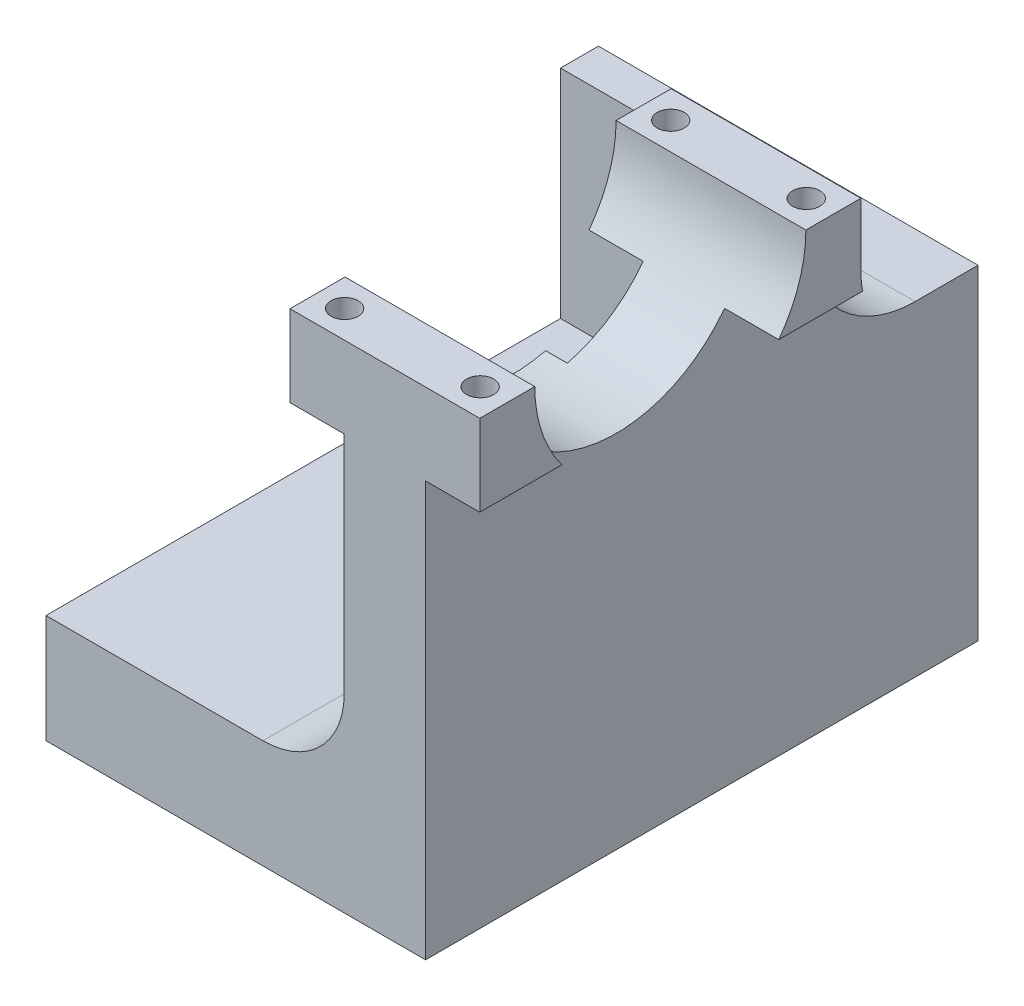
ISO-10303-21;
HEADER;
FILE_DESCRIPTION(('STEP AP214'),'2;1');
FILE_NAME('part.step','',(''),(''),'','','');
FILE_SCHEMA(('AUTOMOTIVE_DESIGN { 1 0 10303 214 1 1 1 1 }'));
ENDSEC;
DATA;
#1=APPLICATION_CONTEXT('core data for automotive mechanical design processes');
#2=APPLICATION_PROTOCOL_DEFINITION('international standard','automotive_design',2000,#1);
#3=PRODUCT_CONTEXT('',#1,'mechanical');
#4=PRODUCT('Part','Part','',(#3));
#5=PRODUCT_RELATED_PRODUCT_CATEGORY('part','',(#4));
#6=PRODUCT_DEFINITION_FORMATION('','',#4);
#7=PRODUCT_DEFINITION_CONTEXT('part definition',#1,'design');
#8=PRODUCT_DEFINITION('design','',#6,#7);
#9=PRODUCT_DEFINITION_SHAPE('','',#8);
#10=(LENGTH_UNIT() NAMED_UNIT(*) SI_UNIT(.MILLI.,.METRE.));
#11=(NAMED_UNIT(*) PLANE_ANGLE_UNIT() SI_UNIT($,.RADIAN.));
#12=(NAMED_UNIT(*) SI_UNIT($,.STERADIAN.) SOLID_ANGLE_UNIT());
#13=UNCERTAINTY_MEASURE_WITH_UNIT(LENGTH_MEASURE(1.E-05),#10,'distance_accuracy_value','');
#14=(GEOMETRIC_REPRESENTATION_CONTEXT(3) GLOBAL_UNCERTAINTY_ASSIGNED_CONTEXT((#13)) GLOBAL_UNIT_ASSIGNED_CONTEXT((#10,
#11,#12)) REPRESENTATION_CONTEXT('',''));
#15=CARTESIAN_POINT('',(0.,0.,0.));
#16=DIRECTION('',(0.,0.,1.));
#17=DIRECTION('',(1.,0.,0.));
#18=AXIS2_PLACEMENT_3D('',#15,#16,#17);
#19=CARTESIAN_POINT('',(-65.425,59.,35.0524601018634));
#20=DIRECTION('',(1.,0.,0.));
#21=DIRECTION('',(0.,0.,-1.));
#22=AXIS2_PLACEMENT_3D('',#19,#20,#21);
#23=CYLINDRICAL_SURFACE('',#22,10.);
#24=CARTESIAN_POINT('',(-52.925,59.,35.0524601018634));
#25=DIRECTION('',(-1.,0.,0.));
#26=DIRECTION('',(0.,0.,1.));
#27=AXIS2_PLACEMENT_3D('',#24,#25,#26);
#28=CIRCLE('',#27,10.);
#29=CARTESIAN_POINT('',(-52.925,57.25,44.898144435621));
#30=VERTEX_POINT('',#29);
#31=CARTESIAN_POINT('',(-52.925,59.,45.0524601018634));
#32=VERTEX_POINT('',#31);
#33=EDGE_CURVE('E422',#30,#32,#28,.T.);
#34=ORIENTED_EDGE('',*,*,#33,.F.);
#35=DIRECTION('',(1.,0.,0.));
#36=VECTOR('',#35,1.);
#37=CARTESIAN_POINT('',(-65.425,57.25,44.898144435621));
#38=LINE('',#37,#36);
#39=CARTESIAN_POINT('',(-57.925,57.25,44.898144435621));
#40=VERTEX_POINT('',#39);
#41=EDGE_CURVE('E419',#40,#30,#38,.T.);
#42=ORIENTED_EDGE('',*,*,#41,.F.);
#43=CARTESIAN_POINT('',(-57.925,59.,35.0524601018634));
#44=DIRECTION('',(-1.,0.,0.));
#45=DIRECTION('',(0.,0.,1.));
#46=AXIS2_PLACEMENT_3D('',#43,#44,#45);
#47=CIRCLE('',#46,10.);
#48=CARTESIAN_POINT('',(-57.925,49.,35.0524601018634));
#49=VERTEX_POINT('',#48);
#50=EDGE_CURVE('E43',#40,#49,#47,.F.);
#51=ORIENTED_EDGE('',*,*,#50,.T.);
#52=DIRECTION('',(-1.,0.,0.));
#53=VECTOR('',#52,1.);
#54=CARTESIAN_POINT('',(-65.425,49.,35.0524601018634));
#55=LINE('',#54,#53);
#56=CARTESIAN_POINT('',(-65.425,49.,35.0524601018634));
#57=VERTEX_POINT('',#56);
#58=EDGE_CURVE('E211',#57,#49,#55,.F.);
#59=ORIENTED_EDGE('',*,*,#58,.F.);
#60=CARTESIAN_POINT('',(-65.425,59.,35.0524601018634));
#61=DIRECTION('',(-1.,0.,0.));
#62=DIRECTION('',(0.,0.,1.));
#63=AXIS2_PLACEMENT_3D('',#60,#61,#62);
#64=CIRCLE('',#63,10.);
#65=CARTESIAN_POINT('',(-65.425,57.25,44.898144435621));
#66=VERTEX_POINT('',#65);
#67=EDGE_CURVE('E11',#57,#66,#64,.T.);
#68=ORIENTED_EDGE('',*,*,#67,.T.);
#69=DIRECTION('',(1.,0.,0.));
#70=VECTOR('',#69,1.);
#71=CARTESIAN_POINT('',(-65.425,57.25,44.898144435621));
#72=LINE('',#71,#70);
#73=CARTESIAN_POINT('',(-70.425,57.25,44.898144435621));
#74=VERTEX_POINT('',#73);
#75=EDGE_CURVE('E427',#74,#66,#72,.T.);
#76=ORIENTED_EDGE('',*,*,#75,.F.);
#77=CARTESIAN_POINT('',(-70.425,59.,35.0524601018634));
#78=DIRECTION('',(1.,0.,0.));
#79=DIRECTION('',(0.,0.,-1.));
#80=AXIS2_PLACEMENT_3D('',#77,#78,#79);
#81=CIRCLE('',#80,10.);
#82=CARTESIAN_POINT('',(-70.425,59.,45.0524601018634));
#83=VERTEX_POINT('',#82);
#84=EDGE_CURVE('E424',#83,#74,#81,.T.);
#85=ORIENTED_EDGE('',*,*,#84,.F.);
#86=DIRECTION('',(-1.,0.,0.));
#87=VECTOR('',#86,1.);
#88=CARTESIAN_POINT('',(-65.425,59.,45.0524601018634));
#89=LINE('',#88,#87);
#90=EDGE_CURVE('E415',#32,#83,#89,.T.);
#91=ORIENTED_EDGE('',*,*,#90,.F.);
#92=EDGE_LOOP('',(#34,#42,#51,#59,#68,#76,#85,#91));
#93=FACE_BOUND('',#92,.T.);
#94=ADVANCED_FACE('F36',(#93),#23,.F.);
#95=CARTESIAN_POINT('',(-65.425,-35.9364248901641,45.0524601018634));
#96=DIRECTION('',(0.,0.,1.));
#97=DIRECTION('',(1.,0.,0.));
#98=AXIS2_PLACEMENT_3D('',#95,#96,#97);
#99=PLANE('',#98);
#100=DIRECTION('',(0.,-1.,0.));
#101=VECTOR('',#100,1.);
#102=CARTESIAN_POINT('',(-52.925,64.75,45.0524601018634));
#103=LINE('',#102,#101);
#104=CARTESIAN_POINT('',(-52.925,64.75,45.0524601018634));
#105=VERTEX_POINT('',#104);
#106=EDGE_CURVE('E364',#105,#32,#103,.T.);
#107=ORIENTED_EDGE('',*,*,#106,.T.);
#108=ORIENTED_EDGE('',*,*,#90,.T.);
#109=DIRECTION('',(0.,-1.,0.));
#110=VECTOR('',#109,1.);
#111=CARTESIAN_POINT('',(-70.425,64.75,45.0524601018634));
#112=LINE('',#111,#110);
#113=CARTESIAN_POINT('',(-70.425,64.75,45.0524601018634));
#114=VERTEX_POINT('',#113);
#115=EDGE_CURVE('E346',#114,#83,#112,.T.);
#116=ORIENTED_EDGE('',*,*,#115,.F.);
#117=DIRECTION('',(1.,0.,0.));
#118=VECTOR('',#117,1.);
#119=CARTESIAN_POINT('',(-65.425,64.75,45.0524601018634));
#120=LINE('',#119,#118);
#121=EDGE_CURVE('E388',#114,#105,#120,.T.);
#122=ORIENTED_EDGE('',*,*,#121,.T.);
#123=EDGE_LOOP('',(#107,#108,#116,#122));
#124=FACE_BOUND('',#123,.T.);
#125=ADVANCED_FACE('F503',(#124),#99,.F.);
#126=CARTESIAN_POINT('',(-65.425,-35.9364248901641,45.0524601018634));
#127=DIRECTION('',(-1.,0.,0.));
#128=DIRECTION('',(0.,0.,1.));
#129=AXIS2_PLACEMENT_3D('',#126,#127,#128);
#130=PLANE('',#129);
#131=DIRECTION('',(0.,1.,0.));
#132=VECTOR('',#131,1.);
#133=CARTESIAN_POINT('',(-65.425,49.25,59.625));
#134=LINE('',#133,#132);
#135=CARTESIAN_POINT('',(-65.425,49.25,59.625));
#136=VERTEX_POINT('',#135);
#137=CARTESIAN_POINT('',(-65.425,52.6153389004884,59.625));
#138=VERTEX_POINT('',#137);
#139=EDGE_CURVE('E252',#136,#138,#134,.T.);
#140=ORIENTED_EDGE('',*,*,#139,.T.);
#141=CARTESIAN_POINT('',(-65.425,64.75,62.625));
#142=DIRECTION('',(-1.,0.,0.));
#143=DIRECTION('',(0.,0.,1.));
#144=AXIS2_PLACEMENT_3D('',#141,#142,#143);
#145=CIRCLE('',#144,12.5);
#146=CARTESIAN_POINT('',(-65.425,57.25,52.625));
#147=VERTEX_POINT('',#146);
#148=EDGE_CURVE('E384',#138,#147,#145,.F.);
#149=ORIENTED_EDGE('',*,*,#148,.T.);
#150=DIRECTION('',(0.,0.,1.));
#151=VECTOR('',#150,1.);
#152=CARTESIAN_POINT('',(-65.425,57.25,45.0524601018634));
#153=LINE('',#152,#151);
#154=EDGE_CURVE('E50',#66,#147,#153,.T.);
#155=ORIENTED_EDGE('',*,*,#154,.F.);
#156=ORIENTED_EDGE('',*,*,#67,.F.);
#157=DIRECTION('',(0.,0.,1.));
#158=VECTOR('',#157,1.);
#159=CARTESIAN_POINT('',(-65.425,49.,32.7524601018634));
#160=LINE('',#159,#158);
#161=CARTESIAN_POINT('',(-65.425,49.,32.7524601018634));
#162=VERTEX_POINT('',#161);
#163=EDGE_CURVE('E214',#162,#57,#160,.T.);
#164=ORIENTED_EDGE('',*,*,#163,.F.);
#165=DIRECTION('',(0.,1.,0.));
#166=VECTOR('',#165,1.);
#167=CARTESIAN_POINT('',(-65.425,49.,32.7524601018634));
#168=LINE('',#167,#166);
#169=CARTESIAN_POINT('',(-65.425,36.5,32.7524601018634));
#170=VERTEX_POINT('',#169);
#171=EDGE_CURVE('E215',#170,#162,#168,.T.);
#172=ORIENTED_EDGE('',*,*,#171,.F.);
#173=DIRECTION('',(0.,0.,-1.));
#174=VECTOR('',#173,1.);
#175=CARTESIAN_POINT('',(-65.425,36.5,45.0524601018634));
#176=LINE('',#175,#174);
#177=CARTESIAN_POINT('',(-65.425,36.5,80.1975398981366));
#178=VERTEX_POINT('',#177);
#179=EDGE_CURVE('E410',#170,#178,#176,.F.);
#180=ORIENTED_EDGE('',*,*,#179,.T.);
#181=DIRECTION('',(0.,1.,0.));
#182=VECTOR('',#181,1.);
#183=CARTESIAN_POINT('',(-65.425,-35.9364248901641,80.1975398981366));
#184=LINE('',#183,#182);
#185=CARTESIAN_POINT('',(-65.425,57.25,80.1975398981366));
#186=VERTEX_POINT('',#185);
#187=EDGE_CURVE('E392',#178,#186,#184,.T.);
#188=ORIENTED_EDGE('',*,*,#187,.T.);
#189=DIRECTION('',(0.,0.,-1.));
#190=VECTOR('',#189,1.);
#191=CARTESIAN_POINT('',(-65.425,57.25,80.1975398981366));
#192=LINE('',#191,#190);
#193=CARTESIAN_POINT('',(-65.425,57.25,72.625));
#194=VERTEX_POINT('',#193);
#195=EDGE_CURVE('E325',#186,#194,#192,.T.);
#196=ORIENTED_EDGE('',*,*,#195,.T.);
#197=CARTESIAN_POINT('',(-65.425,52.6153389004884,65.625));
#198=VERTEX_POINT('',#197);
#199=EDGE_CURVE('E385',#194,#198,#145,.F.);
#200=ORIENTED_EDGE('',*,*,#199,.T.);
#201=DIRECTION('',(0.,1.,0.));
#202=VECTOR('',#201,1.);
#203=CARTESIAN_POINT('',(-65.425,49.25,65.625));
#204=LINE('',#203,#202);
#205=CARTESIAN_POINT('',(-65.425,49.25,65.625));
#206=VERTEX_POINT('',#205);
#207=EDGE_CURVE('E267',#206,#198,#204,.T.);
#208=ORIENTED_EDGE('',*,*,#207,.F.);
#209=DIRECTION('',(0.,0.,1.));
#210=VECTOR('',#209,1.);
#211=CARTESIAN_POINT('',(-65.425,49.25,62.625));
#212=LINE('',#211,#210);
#213=EDGE_CURVE('E263',#136,#206,#212,.T.);
#214=ORIENTED_EDGE('',*,*,#213,.F.);
#215=EDGE_LOOP('',(#140,#149,#155,#156,#164,#172,#180,#188,#196,#200,#208,#214));
#216=FACE_BOUND('',#215,.T.);
#217=ADVANCED_FACE('F452',(#216),#130,.T.);
#218=CARTESIAN_POINT('',(-72.925,36.5,0.));
#219=DIRECTION('',(0.,0.,-1.));
#220=DIRECTION('',(-1.,0.,0.));
#221=AXIS2_PLACEMENT_3D('',#218,#219,#220);
#222=CYLINDRICAL_SURFACE('',#221,7.5);
#223=DIRECTION('',(0.,0.,-1.));
#224=VECTOR('',#223,1.);
#225=CARTESIAN_POINT('',(-72.925,29.,0.));
#226=LINE('',#225,#224);
#227=CARTESIAN_POINT('',(-72.925,29.,80.1975398981366));
#228=VERTEX_POINT('',#227);
#229=CARTESIAN_POINT('',(-72.925,29.,32.7524601018634));
#230=VERTEX_POINT('',#229);
#231=EDGE_CURVE('E400',#228,#230,#226,.T.);
#232=ORIENTED_EDGE('',*,*,#231,.F.);
#233=CARTESIAN_POINT('',(-72.925,36.5,80.1975398981366));
#234=DIRECTION('',(0.,0.,1.));
#235=DIRECTION('',(1.,0.,0.));
#236=AXIS2_PLACEMENT_3D('',#233,#234,#235);
#237=CIRCLE('',#236,7.5);
#238=EDGE_CURVE('E413',#228,#178,#237,.T.);
#239=ORIENTED_EDGE('',*,*,#238,.T.);
#240=ORIENTED_EDGE('',*,*,#179,.F.);
#241=CARTESIAN_POINT('',(-72.925,36.5,32.7524601018634));
#242=DIRECTION('',(0.,0.,1.));
#243=DIRECTION('',(1.,0.,0.));
#244=AXIS2_PLACEMENT_3D('',#241,#242,#243);
#245=CIRCLE('',#244,7.5);
#246=EDGE_CURVE('E246',#230,#170,#245,.T.);
#247=ORIENTED_EDGE('',*,*,#246,.F.);
#248=EDGE_LOOP('',(#232,#239,#240,#247));
#249=FACE_BOUND('',#248,.T.);
#250=ADVANCED_FACE('F510',(#249),#222,.F.);
#251=CARTESIAN_POINT('',(-55.425,0.,47.5887300509317));
#252=DIRECTION('',(0.,1.,0.));
#253=DIRECTION('',(0.,0.,1.));
#254=AXIS2_PLACEMENT_3D('',#251,#252,#253);
#255=CYLINDRICAL_SURFACE('',#254,1.25);
#256=CARTESIAN_POINT('',(-55.425,57.25,47.5887300509317));
#257=DIRECTION('',(0.,-1.,0.));
#258=DIRECTION('',(0.,0.,-1.));
#259=AXIS2_PLACEMENT_3D('',#256,#257,#258);
#260=CIRCLE('',#259,1.25);
#261=CARTESIAN_POINT('',(-55.425,57.25,46.3387300509317));
#262=VERTEX_POINT('',#261);
#263=EDGE_CURVE('E363',#262,#262,#260,.F.);
#264=ORIENTED_EDGE('',*,*,#263,.F.);
#265=EDGE_LOOP('',(#264));
#266=FACE_BOUND('',#265,.T.);
#267=CARTESIAN_POINT('',(-55.425,64.75,47.5887300509317));
#268=DIRECTION('',(0.,-1.,0.));
#269=DIRECTION('',(0.,0.,-1.));
#270=AXIS2_PLACEMENT_3D('',#267,#268,#269);
#271=CIRCLE('',#270,1.25);
#272=CARTESIAN_POINT('',(-55.425,64.75,46.3387300509317));
#273=VERTEX_POINT('',#272);
#274=EDGE_CURVE('E360',#273,#273,#271,.T.);
#275=ORIENTED_EDGE('',*,*,#274,.F.);
#276=EDGE_LOOP('',(#275));
#277=FACE_BOUND('',#276,.T.);
#278=ADVANCED_FACE('F517',(#266,#277),#255,.F.);
#279=CARTESIAN_POINT('',(-67.925,0.,47.5887300509317));
#280=DIRECTION('',(0.,1.,0.));
#281=DIRECTION('',(0.,0.,1.));
#282=AXIS2_PLACEMENT_3D('',#279,#280,#281);
#283=CYLINDRICAL_SURFACE('',#282,1.25);
#284=CARTESIAN_POINT('',(-67.925,64.75,47.5887300509317));
#285=DIRECTION('',(0.,1.,0.));
#286=DIRECTION('',(0.,0.,-1.));
#287=AXIS2_PLACEMENT_3D('',#284,#285,#286);
#288=CIRCLE('',#287,1.25);
#289=CARTESIAN_POINT('',(-67.925,64.75,46.3387300509317));
#290=VERTEX_POINT('',#289);
#291=EDGE_CURVE('E342',#290,#290,#288,.T.);
#292=ORIENTED_EDGE('',*,*,#291,.T.);
#293=EDGE_LOOP('',(#292));
#294=FACE_BOUND('',#293,.T.);
#295=CARTESIAN_POINT('',(-67.925,57.25,47.5887300509317));
#296=DIRECTION('',(0.,1.,0.));
#297=DIRECTION('',(0.,0.,1.));
#298=AXIS2_PLACEMENT_3D('',#295,#296,#297);
#299=CIRCLE('',#298,1.25);
#300=CARTESIAN_POINT('',(-67.925,57.25,48.8387300509317));
#301=VERTEX_POINT('',#300);
#302=EDGE_CURVE('E345',#301,#301,#299,.T.);
#303=ORIENTED_EDGE('',*,*,#302,.F.);
#304=EDGE_LOOP('',(#303));
#305=FACE_BOUND('',#304,.T.);
#306=ADVANCED_FACE('F522',(#294,#305),#283,.F.);
#307=CARTESIAN_POINT('',(-67.925,0.,77.6612699490683));
#308=DIRECTION('',(0.,1.,0.));
#309=DIRECTION('',(0.,0.,1.));
#310=AXIS2_PLACEMENT_3D('',#307,#308,#309);
#311=CYLINDRICAL_SURFACE('',#310,1.25);
#312=CARTESIAN_POINT('',(-67.925,57.25,77.6612699490683));
#313=DIRECTION('',(0.,-1.,0.));
#314=DIRECTION('',(0.,0.,-1.));
#315=AXIS2_PLACEMENT_3D('',#312,#313,#314);
#316=CIRCLE('',#315,1.25);
#317=CARTESIAN_POINT('',(-67.925,57.25,76.4112699490683));
#318=VERTEX_POINT('',#317);
#319=EDGE_CURVE('E320',#318,#318,#316,.F.);
#320=ORIENTED_EDGE('',*,*,#319,.F.);
#321=EDGE_LOOP('',(#320));
#322=FACE_BOUND('',#321,.T.);
#323=CARTESIAN_POINT('',(-67.925,64.75,77.6612699490683));
#324=DIRECTION('',(0.,-1.,0.));
#325=DIRECTION('',(0.,0.,1.));
#326=AXIS2_PLACEMENT_3D('',#323,#324,#325);
#327=CIRCLE('',#326,1.25);
#328=CARTESIAN_POINT('',(-67.925,64.75,78.9112699490683));
#329=VERTEX_POINT('',#328);
#330=EDGE_CURVE('E317',#329,#329,#327,.T.);
#331=ORIENTED_EDGE('',*,*,#330,.F.);
#332=EDGE_LOOP('',(#331));
#333=FACE_BOUND('',#332,.T.);
#334=ADVANCED_FACE('F539',(#322,#333),#311,.F.);
#335=CARTESIAN_POINT('',(-55.425,0.,77.6612699490683));
#336=DIRECTION('',(0.,1.,0.));
#337=DIRECTION('',(0.,0.,1.));
#338=AXIS2_PLACEMENT_3D('',#335,#336,#337);
#339=CYLINDRICAL_SURFACE('',#338,1.25);
#340=CARTESIAN_POINT('',(-55.425,64.75,77.6612699490683));
#341=DIRECTION('',(0.,1.,0.));
#342=DIRECTION('',(0.,0.,1.));
#343=AXIS2_PLACEMENT_3D('',#340,#341,#342);
#344=CIRCLE('',#343,1.25);
#345=CARTESIAN_POINT('',(-55.425,64.75,78.9112699490683));
#346=VERTEX_POINT('',#345);
#347=EDGE_CURVE('E291',#346,#346,#344,.T.);
#348=ORIENTED_EDGE('',*,*,#347,.T.);
#349=EDGE_LOOP('',(#348));
#350=FACE_BOUND('',#349,.T.);
#351=CARTESIAN_POINT('',(-55.425,57.25,77.6612699490683));
#352=DIRECTION('',(0.,1.,0.));
#353=DIRECTION('',(0.,0.,1.));
#354=AXIS2_PLACEMENT_3D('',#351,#352,#353);
#355=CIRCLE('',#354,1.25);
#356=CARTESIAN_POINT('',(-55.425,57.25,78.9112699490683));
#357=VERTEX_POINT('',#356);
#358=EDGE_CURVE('E296',#357,#357,#355,.T.);
#359=ORIENTED_EDGE('',*,*,#358,.F.);
#360=EDGE_LOOP('',(#359));
#361=FACE_BOUND('',#360,.T.);
#362=ADVANCED_FACE('F536',(#350,#361),#339,.F.);
#363=CARTESIAN_POINT('',(-52.925,57.25,45.0524601018634));
#364=DIRECTION('',(0.,-1.,0.));
#365=DIRECTION('',(0.,0.,-1.));
#366=AXIS2_PLACEMENT_3D('',#363,#364,#365);
#367=PLANE('',#366);
#368=ORIENTED_EDGE('',*,*,#263,.T.);
#369=EDGE_LOOP('',(#368));
#370=FACE_BOUND('',#369,.T.);
#371=DIRECTION('',(0.,0.,1.));
#372=VECTOR('',#371,1.);
#373=CARTESIAN_POINT('',(-57.925,57.25,45.0524601018634));
#374=LINE('',#373,#372);
#375=CARTESIAN_POINT('',(-57.925,57.25,52.625));
#376=VERTEX_POINT('',#375);
#377=EDGE_CURVE('E368',#40,#376,#374,.T.);
#378=ORIENTED_EDGE('',*,*,#377,.F.);
#379=ORIENTED_EDGE('',*,*,#41,.T.);
#380=DIRECTION('',(0.,0.,1.));
#381=VECTOR('',#380,1.);
#382=CARTESIAN_POINT('',(-52.925,57.25,45.0524601018634));
#383=LINE('',#382,#381);
#384=CARTESIAN_POINT('',(-52.925,57.25,52.625));
#385=VERTEX_POINT('',#384);
#386=EDGE_CURVE('E374',#30,#385,#383,.T.);
#387=ORIENTED_EDGE('',*,*,#386,.T.);
#388=DIRECTION('',(-1.,0.,0.));
#389=VECTOR('',#388,1.);
#390=CARTESIAN_POINT('',(-52.925,57.25,52.625));
#391=LINE('',#390,#389);
#392=EDGE_CURVE('E377',#385,#376,#391,.T.);
#393=ORIENTED_EDGE('',*,*,#392,.T.);
#394=EDGE_LOOP('',(#378,#379,#387,#393));
#395=FACE_BOUND('',#394,.T.);
#396=ADVANCED_FACE('F433',(#370,#395),#367,.T.);
#397=CARTESIAN_POINT('',(-52.925,64.7500000000001,62.6250000000002));
#398=DIRECTION('',(-1.,0.,0.));
#399=DIRECTION('',(0.,0.,-1.));
#400=AXIS2_PLACEMENT_3D('',#397,#398,#399);
#401=PLANE('',#400);
#402=ORIENTED_EDGE('',*,*,#106,.F.);
#403=DIRECTION('',(0.,0.,-1.));
#404=VECTOR('',#403,1.);
#405=CARTESIAN_POINT('',(-52.925,64.75,45.0524601018634));
#406=LINE('',#405,#404);
#407=CARTESIAN_POINT('',(-52.925,64.75,50.125));
#408=VERTEX_POINT('',#407);
#409=EDGE_CURVE('E367',#408,#105,#406,.T.);
#410=ORIENTED_EDGE('',*,*,#409,.F.);
#411=CARTESIAN_POINT('',(-52.925,64.7500000000001,62.6250000000002));
#412=DIRECTION('',(1.,0.,0.));
#413=DIRECTION('',(0.,0.,-1.));
#414=AXIS2_PLACEMENT_3D('',#411,#412,#413);
#415=CIRCLE('',#414,12.5000000000002);
#416=EDGE_CURVE('E371',#385,#408,#415,.T.);
#417=ORIENTED_EDGE('',*,*,#416,.F.);
#418=ORIENTED_EDGE('',*,*,#386,.F.);
#419=ORIENTED_EDGE('',*,*,#33,.T.);
#420=EDGE_LOOP('',(#402,#410,#417,#418,#419));
#421=FACE_BOUND('',#420,.T.);
#422=ADVANCED_FACE('F441',(#421),#401,.F.);
#423=CARTESIAN_POINT('',(0.,64.75,0.));
#424=DIRECTION('',(0.,-1.,0.));
#425=DIRECTION('',(0.,0.,1.));
#426=AXIS2_PLACEMENT_3D('',#423,#424,#425);
#427=PLANE('',#426);
#428=ORIENTED_EDGE('',*,*,#291,.F.);
#429=EDGE_LOOP('',(#428));
#430=FACE_BOUND('',#429,.T.);
#431=ORIENTED_EDGE('',*,*,#274,.T.);
#432=EDGE_LOOP('',(#431));
#433=FACE_BOUND('',#432,.T.);
#434=DIRECTION('',(1.,0.,0.));
#435=VECTOR('',#434,1.);
#436=CARTESIAN_POINT('',(-70.425,64.75,50.125));
#437=LINE('',#436,#435);
#438=CARTESIAN_POINT('',(-70.425,64.75,50.125));
#439=VERTEX_POINT('',#438);
#440=EDGE_CURVE('E398',#408,#439,#437,.F.);
#441=ORIENTED_EDGE('',*,*,#440,.F.);
#442=ORIENTED_EDGE('',*,*,#409,.T.);
#443=ORIENTED_EDGE('',*,*,#121,.F.);
#444=DIRECTION('',(0.,0.,-1.));
#445=VECTOR('',#444,1.);
#446=CARTESIAN_POINT('',(-70.425,64.75,45.0524601018634));
#447=LINE('',#446,#445);
#448=EDGE_CURVE('E353',#439,#114,#447,.T.);
#449=ORIENTED_EDGE('',*,*,#448,.F.);
#450=EDGE_LOOP('',(#441,#442,#443,#449));
#451=FACE_BOUND('',#450,.T.);
#452=ADVANCED_FACE('F443',(#430,#433,#451),#427,.F.);
#453=CARTESIAN_POINT('',(-70.425,64.7500000000001,62.6250000000002));
#454=DIRECTION('',(1.,0.,0.));
#455=DIRECTION('',(0.,0.,-1.));
#456=AXIS2_PLACEMENT_3D('',#453,#454,#455);
#457=PLANE('',#456);
#458=ORIENTED_EDGE('',*,*,#115,.T.);
#459=ORIENTED_EDGE('',*,*,#84,.T.);
#460=DIRECTION('',(0.,0.,1.));
#461=VECTOR('',#460,1.);
#462=CARTESIAN_POINT('',(-70.425,57.25,45.0524601018634));
#463=LINE('',#462,#461);
#464=CARTESIAN_POINT('',(-70.425,57.25,52.625));
#465=VERTEX_POINT('',#464);
#466=EDGE_CURVE('E57',#74,#465,#463,.T.);
#467=ORIENTED_EDGE('',*,*,#466,.T.);
#468=CARTESIAN_POINT('',(-70.425,64.7500000000001,62.6250000000002));
#469=DIRECTION('',(1.,0.,0.));
#470=DIRECTION('',(0.,0.,-1.));
#471=AXIS2_PLACEMENT_3D('',#468,#469,#470);
#472=CIRCLE('',#471,12.5000000000002);
#473=EDGE_CURVE('E350',#465,#439,#472,.T.);
#474=ORIENTED_EDGE('',*,*,#473,.T.);
#475=ORIENTED_EDGE('',*,*,#448,.T.);
#476=EDGE_LOOP('',(#458,#459,#467,#474,#475));
#477=FACE_BOUND('',#476,.T.);
#478=ADVANCED_FACE('F447',(#477),#457,.F.);
#479=CARTESIAN_POINT('',(-70.425,57.25,45.0524601018634));
#480=DIRECTION('',(0.,1.,0.));
#481=DIRECTION('',(0.,0.,1.));
#482=AXIS2_PLACEMENT_3D('',#479,#480,#481);
#483=PLANE('',#482);
#484=ORIENTED_EDGE('',*,*,#302,.T.);
#485=EDGE_LOOP('',(#484));
#486=FACE_BOUND('',#485,.T.);
#487=ORIENTED_EDGE('',*,*,#154,.T.);
#488=DIRECTION('',(1.,0.,0.));
#489=VECTOR('',#488,1.);
#490=CARTESIAN_POINT('',(-70.425,57.25,52.625));
#491=LINE('',#490,#489);
#492=EDGE_CURVE('E356',#465,#147,#491,.T.);
#493=ORIENTED_EDGE('',*,*,#492,.F.);
#494=ORIENTED_EDGE('',*,*,#466,.F.);
#495=ORIENTED_EDGE('',*,*,#75,.T.);
#496=EDGE_LOOP('',(#487,#493,#494,#495));
#497=FACE_BOUND('',#496,.T.);
#498=ADVANCED_FACE('F449',(#486,#497),#483,.F.);
#499=CARTESIAN_POINT('',(-70.425,64.75,62.625));
#500=DIRECTION('',(1.,0.,0.));
#501=DIRECTION('',(0.,0.,-1.));
#502=AXIS2_PLACEMENT_3D('',#499,#500,#501);
#503=CYLINDRICAL_SURFACE('',#502,12.5);
#504=ORIENTED_EDGE('',*,*,#148,.F.);
#505=DIRECTION('',(1.,0.,0.));
#506=VECTOR('',#505,1.);
#507=CARTESIAN_POINT('',(-67.425,52.6153389004884,59.625));
#508=LINE('',#507,#506);
#509=CARTESIAN_POINT('',(-67.425,52.6153389004884,59.625));
#510=VERTEX_POINT('',#509);
#511=EDGE_CURVE('E261',#510,#138,#508,.T.);
#512=ORIENTED_EDGE('',*,*,#511,.F.);
#513=CARTESIAN_POINT('',(-67.425,64.750000000003,62.6249999999996));
#514=DIRECTION('',(1.,0.,0.));
#515=DIRECTION('',(0.,0.,1.));
#516=AXIS2_PLACEMENT_3D('',#513,#514,#515);
#517=CIRCLE('',#516,12.500000000003);
#518=CARTESIAN_POINT('',(-67.425,52.6153389004884,65.625));
#519=VERTEX_POINT('',#518);
#520=EDGE_CURVE('E264',#519,#510,#517,.T.);
#521=ORIENTED_EDGE('',*,*,#520,.F.);
#522=DIRECTION('',(1.,0.,0.));
#523=VECTOR('',#522,1.);
#524=CARTESIAN_POINT('',(-67.425,52.6153389004884,65.625));
#525=LINE('',#524,#523);
#526=EDGE_CURVE('E271',#519,#198,#525,.T.);
#527=ORIENTED_EDGE('',*,*,#526,.T.);
#528=ORIENTED_EDGE('',*,*,#199,.F.);
#529=DIRECTION('',(1.,0.,0.));
#530=VECTOR('',#529,1.);
#531=CARTESIAN_POINT('',(-70.425,57.25,72.625));
#532=LINE('',#531,#530);
#533=CARTESIAN_POINT('',(-70.425,57.25,72.625));
#534=VERTEX_POINT('',#533);
#535=EDGE_CURVE('E339',#534,#194,#532,.T.);
#536=ORIENTED_EDGE('',*,*,#535,.F.);
#537=CARTESIAN_POINT('',(-70.425,64.7500000000001,62.6249999999998));
#538=DIRECTION('',(-1.,0.,0.));
#539=DIRECTION('',(0.,0.,1.));
#540=AXIS2_PLACEMENT_3D('',#537,#538,#539);
#541=CIRCLE('',#540,12.5000000000002);
#542=CARTESIAN_POINT('',(-70.425,64.75,75.125));
#543=VERTEX_POINT('',#542);
#544=EDGE_CURVE('E328',#534,#543,#541,.T.);
#545=ORIENTED_EDGE('',*,*,#544,.T.);
#546=DIRECTION('',(1.,0.,0.));
#547=VECTOR('',#546,1.);
#548=CARTESIAN_POINT('',(-70.425,64.75,75.125));
#549=LINE('',#548,#547);
#550=CARTESIAN_POINT('',(-52.925,64.75,75.125));
#551=VERTEX_POINT('',#550);
#552=EDGE_CURVE('E395',#543,#551,#549,.T.);
#553=ORIENTED_EDGE('',*,*,#552,.T.);
#554=CARTESIAN_POINT('',(-52.925,64.7500000000001,62.6249999999998));
#555=DIRECTION('',(-1.,0.,0.));
#556=DIRECTION('',(0.,0.,1.));
#557=AXIS2_PLACEMENT_3D('',#554,#555,#556);
#558=CIRCLE('',#557,12.5000000000002);
#559=CARTESIAN_POINT('',(-52.925,57.25,72.625));
#560=VERTEX_POINT('',#559);
#561=EDGE_CURVE('E303',#560,#551,#558,.T.);
#562=ORIENTED_EDGE('',*,*,#561,.F.);
#563=DIRECTION('',(-1.,0.,0.));
#564=VECTOR('',#563,1.);
#565=CARTESIAN_POINT('',(-52.925,57.25,72.625));
#566=LINE('',#565,#564);
#567=CARTESIAN_POINT('',(-57.925,57.25,72.625));
#568=VERTEX_POINT('',#567);
#569=EDGE_CURVE('E309',#560,#568,#566,.T.);
#570=ORIENTED_EDGE('',*,*,#569,.T.);
#571=CARTESIAN_POINT('',(-57.925,64.75,62.625));
#572=DIRECTION('',(-1.,0.,0.));
#573=DIRECTION('',(0.,0.,1.));
#574=AXIS2_PLACEMENT_3D('',#571,#572,#573);
#575=CIRCLE('',#574,12.5);
#576=EDGE_CURVE('E382',#376,#568,#575,.T.);
#577=ORIENTED_EDGE('',*,*,#576,.F.);
#578=ORIENTED_EDGE('',*,*,#392,.F.);
#579=ORIENTED_EDGE('',*,*,#416,.T.);
#580=ORIENTED_EDGE('',*,*,#440,.T.);
#581=ORIENTED_EDGE('',*,*,#473,.F.);
#582=ORIENTED_EDGE('',*,*,#492,.T.);
#583=EDGE_LOOP('',(#504,#512,#521,#527,#528,#536,#545,#553,#562,#570,#577,#578,#579,#580,#581,#582));
#584=FACE_BOUND('',#583,.T.);
#585=ADVANCED_FACE('F437',(#584),#503,.F.);
#586=CARTESIAN_POINT('',(-70.425,57.25,80.1975398981366));
#587=DIRECTION('',(0.,-1.,0.));
#588=DIRECTION('',(0.,0.,-1.));
#589=AXIS2_PLACEMENT_3D('',#586,#587,#588);
#590=PLANE('',#589);
#591=ORIENTED_EDGE('',*,*,#319,.T.);
#592=EDGE_LOOP('',(#591));
#593=FACE_BOUND('',#592,.T.);
#594=ORIENTED_EDGE('',*,*,#195,.F.);
#595=DIRECTION('',(1.,0.,0.));
#596=VECTOR('',#595,1.);
#597=CARTESIAN_POINT('',(-70.425,57.25,80.1975398981366));
#598=LINE('',#597,#596);
#599=CARTESIAN_POINT('',(-70.425,57.25,80.1975398981366));
#600=VERTEX_POINT('',#599);
#601=EDGE_CURVE('E334',#600,#186,#598,.T.);
#602=ORIENTED_EDGE('',*,*,#601,.F.);
#603=DIRECTION('',(0.,0.,-1.));
#604=VECTOR('',#603,1.);
#605=CARTESIAN_POINT('',(-70.425,57.25,80.1975398981366));
#606=LINE('',#605,#604);
#607=EDGE_CURVE('E331',#600,#534,#606,.T.);
#608=ORIENTED_EDGE('',*,*,#607,.T.);
#609=ORIENTED_EDGE('',*,*,#535,.T.);
#610=EDGE_LOOP('',(#594,#602,#608,#609));
#611=FACE_BOUND('',#610,.T.);
#612=ADVANCED_FACE('F468',(#593,#611),#590,.T.);
#613=CARTESIAN_POINT('',(-70.425,64.7500000000001,62.6249999999998));
#614=DIRECTION('',(1.,0.,0.));
#615=DIRECTION('',(0.,0.,1.));
#616=AXIS2_PLACEMENT_3D('',#613,#614,#615);
#617=PLANE('',#616);
#618=DIRECTION('',(0.,-1.,0.));
#619=VECTOR('',#618,1.);
#620=CARTESIAN_POINT('',(-70.425,64.75,80.1975398981366));
#621=LINE('',#620,#619);
#622=CARTESIAN_POINT('',(-70.425,64.75,80.1975398981366));
#623=VERTEX_POINT('',#622);
#624=EDGE_CURVE('E321',#623,#600,#621,.T.);
#625=ORIENTED_EDGE('',*,*,#624,.F.);
#626=DIRECTION('',(0.,0.,1.));
#627=VECTOR('',#626,1.);
#628=CARTESIAN_POINT('',(-70.425,64.75,80.1975398981366));
#629=LINE('',#628,#627);
#630=EDGE_CURVE('E324',#543,#623,#629,.T.);
#631=ORIENTED_EDGE('',*,*,#630,.F.);
#632=ORIENTED_EDGE('',*,*,#544,.F.);
#633=ORIENTED_EDGE('',*,*,#607,.F.);
#634=EDGE_LOOP('',(#625,#631,#632,#633));
#635=FACE_BOUND('',#634,.T.);
#636=ADVANCED_FACE('F474',(#635),#617,.F.);
#637=ORIENTED_EDGE('',*,*,#347,.F.);
#638=EDGE_LOOP('',(#637));
#639=FACE_BOUND('',#638,.T.);
#640=ORIENTED_EDGE('',*,*,#330,.T.);
#641=EDGE_LOOP('',(#640));
#642=FACE_BOUND('',#641,.T.);
#643=ORIENTED_EDGE('',*,*,#552,.F.);
#644=ORIENTED_EDGE('',*,*,#630,.T.);
#645=DIRECTION('',(1.,0.,0.));
#646=VECTOR('',#645,1.);
#647=CARTESIAN_POINT('',(-65.425,64.75,80.1975398981366));
#648=LINE('',#647,#646);
#649=CARTESIAN_POINT('',(-52.925,64.75,80.1975398981366));
#650=VERTEX_POINT('',#649);
#651=EDGE_CURVE('E390',#623,#650,#648,.T.);
#652=ORIENTED_EDGE('',*,*,#651,.T.);
#653=DIRECTION('',(0.,0.,1.));
#654=VECTOR('',#653,1.);
#655=CARTESIAN_POINT('',(-52.925,64.75,80.1975398981366));
#656=LINE('',#655,#654);
#657=EDGE_CURVE('E306',#551,#650,#656,.T.);
#658=ORIENTED_EDGE('',*,*,#657,.F.);
#659=EDGE_LOOP('',(#643,#644,#652,#658));
#660=FACE_BOUND('',#659,.T.);
#661=ADVANCED_FACE('F476',(#639,#642,#660),#427,.F.);
#662=CARTESIAN_POINT('',(-52.925,64.7500000000001,62.6249999999998));
#663=DIRECTION('',(-1.,0.,0.));
#664=DIRECTION('',(0.,0.,1.));
#665=AXIS2_PLACEMENT_3D('',#662,#663,#664);
#666=PLANE('',#665);
#667=DIRECTION('',(0.,-1.,0.));
#668=VECTOR('',#667,1.);
#669=CARTESIAN_POINT('',(-52.925,64.75,80.1975398981366));
#670=LINE('',#669,#668);
#671=CARTESIAN_POINT('',(-52.925,57.25,80.1975398981366));
#672=VERTEX_POINT('',#671);
#673=EDGE_CURVE('E297',#650,#672,#670,.T.);
#674=ORIENTED_EDGE('',*,*,#673,.T.);
#675=DIRECTION('',(0.,0.,-1.));
#676=VECTOR('',#675,1.);
#677=CARTESIAN_POINT('',(-52.925,57.25,80.1975398981366));
#678=LINE('',#677,#676);
#679=EDGE_CURVE('E300',#672,#560,#678,.T.);
#680=ORIENTED_EDGE('',*,*,#679,.T.);
#681=ORIENTED_EDGE('',*,*,#561,.T.);
#682=ORIENTED_EDGE('',*,*,#657,.T.);
#683=EDGE_LOOP('',(#674,#680,#681,#682));
#684=FACE_BOUND('',#683,.T.);
#685=ADVANCED_FACE('F480',(#684),#666,.F.);
#686=CARTESIAN_POINT('',(-52.925,57.25,80.1975398981366));
#687=DIRECTION('',(0.,1.,0.));
#688=DIRECTION('',(0.,0.,1.));
#689=AXIS2_PLACEMENT_3D('',#686,#687,#688);
#690=PLANE('',#689);
#691=ORIENTED_EDGE('',*,*,#358,.T.);
#692=EDGE_LOOP('',(#691));
#693=FACE_BOUND('',#692,.T.);
#694=DIRECTION('',(0.,0.,-1.));
#695=VECTOR('',#694,1.);
#696=CARTESIAN_POINT('',(-57.925,57.25,80.1975398981366));
#697=LINE('',#696,#695);
#698=CARTESIAN_POINT('',(-57.925,57.25,80.1975398981366));
#699=VERTEX_POINT('',#698);
#700=EDGE_CURVE('E301',#699,#568,#697,.T.);
#701=ORIENTED_EDGE('',*,*,#700,.T.);
#702=ORIENTED_EDGE('',*,*,#569,.F.);
#703=ORIENTED_EDGE('',*,*,#679,.F.);
#704=DIRECTION('',(-1.,0.,0.));
#705=VECTOR('',#704,1.);
#706=CARTESIAN_POINT('',(-52.925,57.25,80.1975398981366));
#707=LINE('',#706,#705);
#708=EDGE_CURVE('E314',#672,#699,#707,.T.);
#709=ORIENTED_EDGE('',*,*,#708,.T.);
#710=EDGE_LOOP('',(#701,#702,#703,#709));
#711=FACE_BOUND('',#710,.T.);
#712=ADVANCED_FACE('F485',(#693,#711),#690,.F.);
#713=CARTESIAN_POINT('',(-65.425,-35.9364248901641,80.1975398981366));
#714=DIRECTION('',(0.,0.,1.));
#715=DIRECTION('',(1.,0.,0.));
#716=AXIS2_PLACEMENT_3D('',#713,#714,#715);
#717=PLANE('',#716);
#718=ORIENTED_EDGE('',*,*,#187,.F.);
#719=ORIENTED_EDGE('',*,*,#238,.F.);
#720=DIRECTION('',(1.,0.,0.));
#721=VECTOR('',#720,1.);
#722=CARTESIAN_POINT('',(-92.925,29.,80.1975398981366));
#723=LINE('',#722,#721);
#724=CARTESIAN_POINT('',(-92.925,29.,80.1975398981366));
#725=VERTEX_POINT('',#724);
#726=EDGE_CURVE('E288',#725,#228,#723,.T.);
#727=ORIENTED_EDGE('',*,*,#726,.F.);
#728=DIRECTION('',(0.,1.,0.));
#729=VECTOR('',#728,1.);
#730=CARTESIAN_POINT('',(-92.925,0.,80.1975398981366));
#731=LINE('',#730,#729);
#732=CARTESIAN_POINT('',(-92.925,19.,80.1975398981366));
#733=VERTEX_POINT('',#732);
#734=EDGE_CURVE('E279',#733,#725,#731,.T.);
#735=ORIENTED_EDGE('',*,*,#734,.F.);
#736=DIRECTION('',(1.,0.,0.));
#737=VECTOR('',#736,1.);
#738=CARTESIAN_POINT('',(-92.925,19.,80.1975398981366));
#739=LINE('',#738,#737);
#740=CARTESIAN_POINT('',(-57.925,19.,80.1975398981366));
#741=VERTEX_POINT('',#740);
#742=EDGE_CURVE('E286',#733,#741,#739,.T.);
#743=ORIENTED_EDGE('',*,*,#742,.T.);
#744=DIRECTION('',(0.,1.,0.));
#745=VECTOR('',#744,1.);
#746=CARTESIAN_POINT('',(-57.925,-35.9364248901641,80.1975398981366));
#747=LINE('',#746,#745);
#748=EDGE_CURVE('E393',#741,#699,#747,.T.);
#749=ORIENTED_EDGE('',*,*,#748,.T.);
#750=ORIENTED_EDGE('',*,*,#708,.F.);
#751=ORIENTED_EDGE('',*,*,#673,.F.);
#752=ORIENTED_EDGE('',*,*,#651,.F.);
#753=ORIENTED_EDGE('',*,*,#624,.T.);
#754=ORIENTED_EDGE('',*,*,#601,.T.);
#755=EDGE_LOOP('',(#718,#719,#727,#735,#743,#749,#750,#751,#752,#753,#754));
#756=FACE_BOUND('',#755,.T.);
#757=ADVANCED_FACE('F491',(#756),#717,.T.);
#758=CARTESIAN_POINT('',(-57.925,-35.9364248901641,45.0524601018634));
#759=DIRECTION('',(-1.,0.,0.));
#760=DIRECTION('',(0.,0.,1.));
#761=AXIS2_PLACEMENT_3D('',#758,#759,#760);
#762=PLANE('',#761);
#763=ORIENTED_EDGE('',*,*,#50,.F.);
#764=ORIENTED_EDGE('',*,*,#377,.T.);
#765=ORIENTED_EDGE('',*,*,#576,.T.);
#766=ORIENTED_EDGE('',*,*,#700,.F.);
#767=ORIENTED_EDGE('',*,*,#748,.F.);
#768=DIRECTION('',(0.,0.,1.));
#769=VECTOR('',#768,1.);
#770=CARTESIAN_POINT('',(-57.925,19.,0.));
#771=LINE('',#770,#769);
#772=CARTESIAN_POINT('',(-57.925,19.,29.2524601018634));
#773=VERTEX_POINT('',#772);
#774=EDGE_CURVE('E221',#773,#741,#771,.T.);
#775=ORIENTED_EDGE('',*,*,#774,.F.);
#776=DIRECTION('',(0.,-1.,0.));
#777=VECTOR('',#776,1.);
#778=CARTESIAN_POINT('',(-57.925,49.,29.2524601018634));
#779=LINE('',#778,#777);
#780=CARTESIAN_POINT('',(-57.925,49.,29.2524601018634));
#781=VERTEX_POINT('',#780);
#782=EDGE_CURVE('E218',#781,#773,#779,.T.);
#783=ORIENTED_EDGE('',*,*,#782,.F.);
#784=DIRECTION('',(0.,0.,1.));
#785=VECTOR('',#784,1.);
#786=CARTESIAN_POINT('',(-57.925,49.,32.7524601018634));
#787=LINE('',#786,#785);
#788=EDGE_CURVE('E202',#781,#49,#787,.T.);
#789=ORIENTED_EDGE('',*,*,#788,.T.);
#790=EDGE_LOOP('',(#763,#764,#765,#766,#767,#775,#783,#789));
#791=FACE_BOUND('',#790,.T.);
#792=ADVANCED_FACE('F219',(#791),#762,.F.);
#793=CARTESIAN_POINT('',(-92.925,29.,0.));
#794=DIRECTION('',(0.,-1.,0.));
#795=DIRECTION('',(0.,0.,-1.));
#796=AXIS2_PLACEMENT_3D('',#793,#794,#795);
#797=PLANE('',#796);
#798=ORIENTED_EDGE('',*,*,#726,.T.);
#799=ORIENTED_EDGE('',*,*,#231,.T.);
#800=DIRECTION('',(1.,0.,0.));
#801=VECTOR('',#800,1.);
#802=CARTESIAN_POINT('',(-92.925,29.,32.7524601018634));
#803=LINE('',#802,#801);
#804=CARTESIAN_POINT('',(-92.925,29.,32.7524601018634));
#805=VERTEX_POINT('',#804);
#806=EDGE_CURVE('E241',#805,#230,#803,.T.);
#807=ORIENTED_EDGE('',*,*,#806,.F.);
#808=DIRECTION('',(0.,0.,-1.));
#809=VECTOR('',#808,1.);
#810=CARTESIAN_POINT('',(-92.925,29.,0.));
#811=LINE('',#810,#809);
#812=EDGE_CURVE('E284',#725,#805,#811,.T.);
#813=ORIENTED_EDGE('',*,*,#812,.F.);
#814=EDGE_LOOP('',(#798,#799,#807,#813));
#815=FACE_BOUND('',#814,.T.);
#816=ADVANCED_FACE('F515',(#815),#797,.F.);
#817=CARTESIAN_POINT('',(-92.925,19.,0.));
#818=DIRECTION('',(0.,1.,0.));
#819=DIRECTION('',(0.,0.,1.));
#820=AXIS2_PLACEMENT_3D('',#817,#818,#819);
#821=PLANE('',#820);
#822=ORIENTED_EDGE('',*,*,#774,.T.);
#823=ORIENTED_EDGE('',*,*,#742,.F.);
#824=DIRECTION('',(0.,0.,1.));
#825=VECTOR('',#824,1.);
#826=CARTESIAN_POINT('',(-92.925,19.,0.));
#827=LINE('',#826,#825);
#828=CARTESIAN_POINT('',(-92.925,19.,29.2524601018634));
#829=VERTEX_POINT('',#828);
#830=EDGE_CURVE('E282',#829,#733,#827,.T.);
#831=ORIENTED_EDGE('',*,*,#830,.F.);
#832=DIRECTION('',(-1.,0.,0.));
#833=VECTOR('',#832,1.);
#834=CARTESIAN_POINT('',(0.,19.,29.2524601018634));
#835=LINE('',#834,#833);
#836=EDGE_CURVE('E233',#773,#829,#835,.T.);
#837=ORIENTED_EDGE('',*,*,#836,.F.);
#838=EDGE_LOOP('',(#822,#823,#831,#837));
#839=FACE_BOUND('',#838,.T.);
#840=ADVANCED_FACE('F489',(#839),#821,.F.);
#841=CARTESIAN_POINT('',(-92.925,0.,0.));
#842=DIRECTION('',(1.,0.,0.));
#843=DIRECTION('',(0.,0.,-1.));
#844=AXIS2_PLACEMENT_3D('',#841,#842,#843);
#845=PLANE('',#844);
#846=ORIENTED_EDGE('',*,*,#734,.T.);
#847=ORIENTED_EDGE('',*,*,#812,.T.);
#848=DIRECTION('',(0.,-1.,0.));
#849=VECTOR('',#848,1.);
#850=CARTESIAN_POINT('',(-92.925,49.,32.7524601018634));
#851=LINE('',#850,#849);
#852=CARTESIAN_POINT('',(-92.925,49.,32.7524601018634));
#853=VERTEX_POINT('',#852);
#854=EDGE_CURVE('E225',#853,#805,#851,.T.);
#855=ORIENTED_EDGE('',*,*,#854,.F.);
#856=DIRECTION('',(0.,0.,-1.));
#857=VECTOR('',#856,1.);
#858=CARTESIAN_POINT('',(-92.925,49.,0.));
#859=LINE('',#858,#857);
#860=CARTESIAN_POINT('',(-92.925,49.,29.2524601018634));
#861=VERTEX_POINT('',#860);
#862=EDGE_CURVE('E226',#853,#861,#859,.T.);
#863=ORIENTED_EDGE('',*,*,#862,.T.);
#864=DIRECTION('',(0.,-1.,0.));
#865=VECTOR('',#864,1.);
#866=CARTESIAN_POINT('',(-92.925,49.,29.2524601018634));
#867=LINE('',#866,#865);
#868=EDGE_CURVE('E230',#861,#829,#867,.T.);
#869=ORIENTED_EDGE('',*,*,#868,.T.);
#870=ORIENTED_EDGE('',*,*,#830,.T.);
#871=EDGE_LOOP('',(#846,#847,#855,#863,#869,#870));
#872=FACE_BOUND('',#871,.T.);
#873=ADVANCED_FACE('F494',(#872),#845,.F.);
#874=CARTESIAN_POINT('',(-67.425,49.25,62.625));
#875=DIRECTION('',(0.,1.,0.));
#876=DIRECTION('',(0.,0.,1.));
#877=AXIS2_PLACEMENT_3D('',#874,#875,#876);
#878=PLANE('',#877);
#879=ORIENTED_EDGE('',*,*,#213,.T.);
#880=DIRECTION('',(1.,0.,0.));
#881=VECTOR('',#880,1.);
#882=CARTESIAN_POINT('',(-67.425,49.25,65.625));
#883=LINE('',#882,#881);
#884=CARTESIAN_POINT('',(-67.425,49.25,65.625));
#885=VERTEX_POINT('',#884);
#886=EDGE_CURVE('E277',#885,#206,#883,.T.);
#887=ORIENTED_EDGE('',*,*,#886,.F.);
#888=DIRECTION('',(0.,0.,1.));
#889=VECTOR('',#888,1.);
#890=CARTESIAN_POINT('',(-67.425,49.25,62.625));
#891=LINE('',#890,#889);
#892=CARTESIAN_POINT('',(-67.425,49.25,59.625));
#893=VERTEX_POINT('',#892);
#894=EDGE_CURVE('E266',#893,#885,#891,.T.);
#895=ORIENTED_EDGE('',*,*,#894,.F.);
#896=DIRECTION('',(1.,0.,0.));
#897=VECTOR('',#896,1.);
#898=CARTESIAN_POINT('',(-67.425,49.25,59.625));
#899=LINE('',#898,#897);
#900=EDGE_CURVE('E256',#893,#136,#899,.T.);
#901=ORIENTED_EDGE('',*,*,#900,.T.);
#902=EDGE_LOOP('',(#879,#887,#895,#901));
#903=FACE_BOUND('',#902,.T.);
#904=ADVANCED_FACE('F609',(#903),#878,.F.);
#905=CARTESIAN_POINT('',(-67.425,49.25,65.625));
#906=DIRECTION('',(0.,0.,-1.));
#907=DIRECTION('',(-1.,0.,0.));
#908=AXIS2_PLACEMENT_3D('',#905,#906,#907);
#909=PLANE('',#908);
#910=ORIENTED_EDGE('',*,*,#207,.T.);
#911=ORIENTED_EDGE('',*,*,#526,.F.);
#912=DIRECTION('',(0.,1.,0.));
#913=VECTOR('',#912,1.);
#914=CARTESIAN_POINT('',(-67.425,49.25,65.625));
#915=LINE('',#914,#913);
#916=EDGE_CURVE('E269',#885,#519,#915,.T.);
#917=ORIENTED_EDGE('',*,*,#916,.F.);
#918=ORIENTED_EDGE('',*,*,#886,.T.);
#919=EDGE_LOOP('',(#910,#911,#917,#918));
#920=FACE_BOUND('',#919,.T.);
#921=ADVANCED_FACE('F644',(#920),#909,.F.);
#922=CARTESIAN_POINT('',(-67.425,64.750000000003,62.6249999999996));
#923=DIRECTION('',(-1.,0.,0.));
#924=DIRECTION('',(0.,0.,1.));
#925=AXIS2_PLACEMENT_3D('',#922,#923,#924);
#926=PLANE('',#925);
#927=ORIENTED_EDGE('',*,*,#520,.T.);
#928=DIRECTION('',(0.,1.,0.));
#929=VECTOR('',#928,1.);
#930=CARTESIAN_POINT('',(-67.425,49.25,59.625));
#931=LINE('',#930,#929);
#932=EDGE_CURVE('E253',#893,#510,#931,.T.);
#933=ORIENTED_EDGE('',*,*,#932,.F.);
#934=ORIENTED_EDGE('',*,*,#894,.T.);
#935=ORIENTED_EDGE('',*,*,#916,.T.);
#936=EDGE_LOOP('',(#927,#933,#934,#935));
#937=FACE_BOUND('',#936,.T.);
#938=ADVANCED_FACE('F460',(#937),#926,.T.);
#939=CARTESIAN_POINT('',(-67.425,49.25,59.625));
#940=DIRECTION('',(0.,0.,-1.));
#941=DIRECTION('',(-1.,0.,0.));
#942=AXIS2_PLACEMENT_3D('',#939,#940,#941);
#943=PLANE('',#942);
#944=ORIENTED_EDGE('',*,*,#139,.F.);
#945=ORIENTED_EDGE('',*,*,#900,.F.);
#946=ORIENTED_EDGE('',*,*,#932,.T.);
#947=ORIENTED_EDGE('',*,*,#511,.T.);
#948=EDGE_LOOP('',(#944,#945,#946,#947));
#949=FACE_BOUND('',#948,.T.);
#950=ADVANCED_FACE('F457',(#949),#943,.T.);
#951=CARTESIAN_POINT('',(-57.925,49.,32.7524601018634));
#952=DIRECTION('',(0.,-1.,0.));
#953=DIRECTION('',(0.,0.,-1.));
#954=AXIS2_PLACEMENT_3D('',#951,#952,#953);
#955=PLANE('',#954);
#956=ORIENTED_EDGE('',*,*,#163,.T.);
#957=ORIENTED_EDGE('',*,*,#58,.T.);
#958=ORIENTED_EDGE('',*,*,#788,.F.);
#959=DIRECTION('',(-1.,0.,0.));
#960=VECTOR('',#959,1.);
#961=CARTESIAN_POINT('',(0.,49.,29.2524601018634));
#962=LINE('',#961,#960);
#963=EDGE_CURVE('E208',#781,#861,#962,.T.);
#964=ORIENTED_EDGE('',*,*,#963,.T.);
#965=ORIENTED_EDGE('',*,*,#862,.F.);
#966=DIRECTION('',(1.,0.,0.));
#967=VECTOR('',#966,1.);
#968=CARTESIAN_POINT('',(0.,49.,32.7524601018634));
#969=LINE('',#968,#967);
#970=EDGE_CURVE('E232',#853,#162,#969,.T.);
#971=ORIENTED_EDGE('',*,*,#970,.T.);
#972=EDGE_LOOP('',(#956,#957,#958,#964,#965,#971));
#973=FACE_BOUND('',#972,.T.);
#974=ADVANCED_FACE('F205',(#973),#955,.F.);
#975=CARTESIAN_POINT('',(0.,49.,32.7524601018634));
#976=DIRECTION('',(0.,0.,-1.));
#977=DIRECTION('',(-1.,0.,0.));
#978=AXIS2_PLACEMENT_3D('',#975,#976,#977);
#979=PLANE('',#978);
#980=ORIENTED_EDGE('',*,*,#854,.T.);
#981=ORIENTED_EDGE('',*,*,#806,.T.);
#982=ORIENTED_EDGE('',*,*,#246,.T.);
#983=ORIENTED_EDGE('',*,*,#171,.T.);
#984=ORIENTED_EDGE('',*,*,#970,.F.);
#985=EDGE_LOOP('',(#980,#981,#982,#983,#984));
#986=FACE_BOUND('',#985,.T.);
#987=ADVANCED_FACE('F498',(#986),#979,.F.);
#988=CARTESIAN_POINT('',(0.,49.,29.2524601018634));
#989=DIRECTION('',(0.,0.,1.));
#990=DIRECTION('',(1.,0.,0.));
#991=AXIS2_PLACEMENT_3D('',#988,#989,#990);
#992=PLANE('',#991);
#993=ORIENTED_EDGE('',*,*,#836,.T.);
#994=ORIENTED_EDGE('',*,*,#868,.F.);
#995=ORIENTED_EDGE('',*,*,#963,.F.);
#996=ORIENTED_EDGE('',*,*,#782,.T.);
#997=EDGE_LOOP('',(#993,#994,#995,#996));
#998=FACE_BOUND('',#997,.T.);
#999=ADVANCED_FACE('F228',(#998),#992,.F.);
#1000=CLOSED_SHELL('',(#94,#125,#217,#250,#278,#306,#334,#362,#396,#422,#452,#478,#498,#585,
#612,#636,#661,#685,#712,#757,#792,#816,#840,#873,#904,#921,#938,#950,#974,#987,#999));
#1001=MANIFOLD_SOLID_BREP('B2',#1000);
#1002=ADVANCED_BREP_SHAPE_REPRESENTATION('',(#18,#1001),#14);
#1003=SHAPE_DEFINITION_REPRESENTATION(#9,#1002);
ENDSEC;
END-ISO-10303-21;
